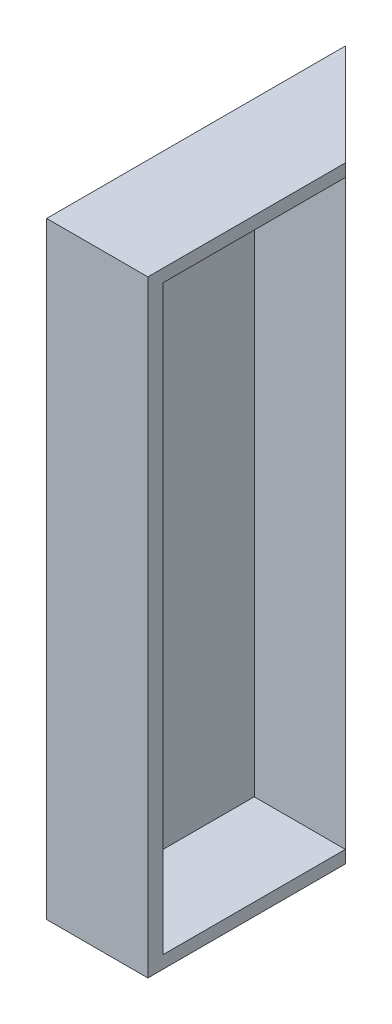
ISO-10303-21;
HEADER;
FILE_DESCRIPTION(('STEP AP214'),'2;1');
FILE_NAME('part.step','',(''),(''),'','','');
FILE_SCHEMA(('AUTOMOTIVE_DESIGN { 1 0 10303 214 1 1 1 1 }'));
ENDSEC;
DATA;
#1=APPLICATION_CONTEXT('core data for automotive mechanical design processes');
#2=APPLICATION_PROTOCOL_DEFINITION('international standard','automotive_design',2000,#1);
#3=PRODUCT_CONTEXT('',#1,'mechanical');
#4=PRODUCT('Part','Part','',(#3));
#5=PRODUCT_RELATED_PRODUCT_CATEGORY('part','',(#4));
#6=PRODUCT_DEFINITION_FORMATION('','',#4);
#7=PRODUCT_DEFINITION_CONTEXT('part definition',#1,'design');
#8=PRODUCT_DEFINITION('design','',#6,#7);
#9=PRODUCT_DEFINITION_SHAPE('','',#8);
#10=(LENGTH_UNIT() NAMED_UNIT(*) SI_UNIT(.MILLI.,.METRE.));
#11=(NAMED_UNIT(*) PLANE_ANGLE_UNIT() SI_UNIT($,.RADIAN.));
#12=(NAMED_UNIT(*) SI_UNIT($,.STERADIAN.) SOLID_ANGLE_UNIT());
#13=UNCERTAINTY_MEASURE_WITH_UNIT(LENGTH_MEASURE(1.E-05),#10,'distance_accuracy_value','');
#14=(GEOMETRIC_REPRESENTATION_CONTEXT(3) GLOBAL_UNCERTAINTY_ASSIGNED_CONTEXT((#13)) GLOBAL_UNIT_ASSIGNED_CONTEXT((#10,
#11,#12)) REPRESENTATION_CONTEXT('',''));
#15=CARTESIAN_POINT('',(0.,0.,0.));
#16=DIRECTION('',(0.,0.,1.));
#17=DIRECTION('',(1.,0.,0.));
#18=AXIS2_PLACEMENT_3D('',#15,#16,#17);
#19=CARTESIAN_POINT('',(0.,60.,22.));
#20=DIRECTION('',(0.,0.,1.));
#21=DIRECTION('',(1.,0.,0.));
#22=AXIS2_PLACEMENT_3D('',#19,#20,#21);
#23=PLANE('',#22);
#24=DIRECTION('',(1.,0.,0.));
#25=VECTOR('',#24,1.);
#26=CARTESIAN_POINT('',(-40.4007940470914,58.75,22.));
#27=LINE('',#26,#25);
#28=CARTESIAN_POINT('',(-21.,58.75,22.));
#29=VERTEX_POINT('',#28);
#30=CARTESIAN_POINT('',(-11.9999999999998,58.75,22.));
#31=VERTEX_POINT('',#30);
#32=EDGE_CURVE('E134',#29,#31,#27,.T.);
#33=ORIENTED_EDGE('',*,*,#32,.F.);
#34=DIRECTION('',(0.,-1.,0.));
#35=VECTOR('',#34,1.);
#36=CARTESIAN_POINT('',(-21.,58.75,22.));
#37=LINE('',#36,#35);
#38=CARTESIAN_POINT('',(-21.,1.25,22.));
#39=VERTEX_POINT('',#38);
#40=EDGE_CURVE('E119',#29,#39,#37,.T.);
#41=ORIENTED_EDGE('',*,*,#40,.T.);
#42=DIRECTION('',(1.,0.,0.));
#43=VECTOR('',#42,1.);
#44=CARTESIAN_POINT('',(-40.4007940470914,1.25,22.));
#45=LINE('',#44,#43);
#46=CARTESIAN_POINT('',(-11.9999999999998,1.25,22.));
#47=VERTEX_POINT('',#46);
#48=EDGE_CURVE('E132',#39,#47,#45,.T.);
#49=ORIENTED_EDGE('',*,*,#48,.T.);
#50=DIRECTION('',(0.,-1.,0.));
#51=VECTOR('',#50,1.);
#52=CARTESIAN_POINT('',(-11.9999999999998,5.,22.));
#53=LINE('',#52,#51);
#54=EDGE_CURVE('E180',#31,#47,#53,.T.);
#55=ORIENTED_EDGE('',*,*,#54,.F.);
#56=EDGE_LOOP('',(#33,#41,#49,#55));
#57=FACE_BOUND('',#56,.T.);
#58=ADVANCED_FACE('F35',(#57),#23,.T.);
#59=CARTESIAN_POINT('',(-40.4007940470914,1.25,0.));
#60=DIRECTION('',(0.,-1.,0.));
#61=DIRECTION('',(0.,0.,-1.));
#62=AXIS2_PLACEMENT_3D('',#59,#60,#61);
#63=PLANE('',#62);
#64=DIRECTION('',(0.,0.,1.));
#65=VECTOR('',#64,1.);
#66=CARTESIAN_POINT('',(-21.,1.25,22.));
#67=LINE('',#66,#65);
#68=CARTESIAN_POINT('',(-21.,1.25,40.0106436452662));
#69=VERTEX_POINT('',#68);
#70=EDGE_CURVE('E115',#39,#69,#67,.T.);
#71=ORIENTED_EDGE('',*,*,#70,.T.);
#72=DIRECTION('',(1.,0.,0.));
#73=VECTOR('',#72,1.);
#74=CARTESIAN_POINT('',(-40.4007940470914,1.25,40.0106436452662));
#75=LINE('',#74,#73);
#76=CARTESIAN_POINT('',(-11.9999999999998,1.25,40.0106436452662));
#77=VERTEX_POINT('',#76);
#78=EDGE_CURVE('E149',#69,#77,#75,.T.);
#79=ORIENTED_EDGE('',*,*,#78,.T.);
#80=DIRECTION('',(0.,0.,-1.));
#81=VECTOR('',#80,1.);
#82=CARTESIAN_POINT('',(-11.9999999999998,1.25,0.));
#83=LINE('',#82,#81);
#84=EDGE_CURVE('E139',#77,#47,#83,.T.);
#85=ORIENTED_EDGE('',*,*,#84,.T.);
#86=ORIENTED_EDGE('',*,*,#48,.F.);
#87=EDGE_LOOP('',(#71,#79,#85,#86));
#88=FACE_BOUND('',#87,.T.);
#89=ADVANCED_FACE('F137',(#88),#63,.F.);
#90=CARTESIAN_POINT('',(-40.4007940470914,0.,40.0106436452662));
#91=DIRECTION('',(0.,0.,1.));
#92=DIRECTION('',(1.,0.,0.));
#93=AXIS2_PLACEMENT_3D('',#90,#91,#92);
#94=PLANE('',#93);
#95=DIRECTION('',(0.,1.,0.));
#96=VECTOR('',#95,1.);
#97=CARTESIAN_POINT('',(-21.,58.75,40.0106436452662));
#98=LINE('',#97,#96);
#99=CARTESIAN_POINT('',(-21.,2.5,40.0106436452662));
#100=VERTEX_POINT('',#99);
#101=EDGE_CURVE('E123',#69,#100,#98,.T.);
#102=ORIENTED_EDGE('',*,*,#101,.T.);
#103=DIRECTION('',(1.,0.,0.));
#104=VECTOR('',#103,1.);
#105=CARTESIAN_POINT('',(-40.4007940470914,2.5,40.0106436452662));
#106=LINE('',#105,#104);
#107=CARTESIAN_POINT('',(-11.9999999999998,2.5,40.0106436452662));
#108=VERTEX_POINT('',#107);
#109=EDGE_CURVE('E141',#100,#108,#106,.T.);
#110=ORIENTED_EDGE('',*,*,#109,.T.);
#111=DIRECTION('',(0.,-1.,0.));
#112=VECTOR('',#111,1.);
#113=CARTESIAN_POINT('',(-11.9999999999998,0.,40.0106436452662));
#114=LINE('',#113,#112);
#115=EDGE_CURVE('E145',#108,#77,#114,.T.);
#116=ORIENTED_EDGE('',*,*,#115,.T.);
#117=ORIENTED_EDGE('',*,*,#78,.F.);
#118=EDGE_LOOP('',(#102,#110,#116,#117));
#119=FACE_BOUND('',#118,.T.);
#120=ADVANCED_FACE('F246',(#119),#94,.F.);
#121=CARTESIAN_POINT('',(-11.9999999999998,5.,22.));
#122=DIRECTION('',(1.,0.,0.));
#123=DIRECTION('',(0.,0.,-1.));
#124=AXIS2_PLACEMENT_3D('',#121,#122,#123);
#125=PLANE('',#124);
#126=DIRECTION('',(0.,-1.,0.));
#127=VECTOR('',#126,1.);
#128=CARTESIAN_POINT('',(-11.9999999999998,70.1115310944917,40.0146252129616));
#129=LINE('',#128,#127);
#130=CARTESIAN_POINT('',(-11.9999999999998,58.75,40.0146252129616));
#131=VERTEX_POINT('',#130);
#132=CARTESIAN_POINT('',(-11.9999999999998,5.,40.0146252129616));
#133=VERTEX_POINT('',#132);
#134=EDGE_CURVE('E167',#131,#133,#129,.T.);
#135=ORIENTED_EDGE('',*,*,#134,.F.);
#136=DIRECTION('',(0.,0.,-1.));
#137=VECTOR('',#136,1.);
#138=CARTESIAN_POINT('',(-11.9999999999998,58.75,0.));
#139=LINE('',#138,#137);
#140=EDGE_CURVE('E212',#131,#31,#139,.T.);
#141=ORIENTED_EDGE('',*,*,#140,.T.);
#142=DIRECTION('',(0.,-1.,0.));
#143=VECTOR('',#142,1.);
#144=CARTESIAN_POINT('',(-11.9999999999998,60.,22.));
#145=LINE('',#144,#143);
#146=CARTESIAN_POINT('',(-11.9999999999998,60.,22.));
#147=VERTEX_POINT('',#146);
#148=EDGE_CURVE('E11',#147,#31,#145,.T.);
#149=ORIENTED_EDGE('',*,*,#148,.F.);
#150=DIRECTION('',(0.,0.,-1.));
#151=VECTOR('',#150,1.);
#152=CARTESIAN_POINT('',(-11.9999999999998,60.,41.5123104518784));
#153=LINE('',#152,#151);
#154=CARTESIAN_POINT('',(-11.9999999999998,60.,41.5123104518784));
#155=VERTEX_POINT('',#154);
#156=EDGE_CURVE('E156',#155,#147,#153,.T.);
#157=ORIENTED_EDGE('',*,*,#156,.F.);
#158=DIRECTION('',(0.,-1.,0.));
#159=VECTOR('',#158,1.);
#160=CARTESIAN_POINT('',(-11.9999999999998,70.1115310944917,41.5123104518784));
#161=LINE('',#160,#159);
#162=CARTESIAN_POINT('',(-11.9999999999998,0.,41.5123104518784));
#163=VERTEX_POINT('',#162);
#164=EDGE_CURVE('E157',#155,#163,#161,.T.);
#165=ORIENTED_EDGE('',*,*,#164,.T.);
#166=DIRECTION('',(0.,0.,1.));
#167=VECTOR('',#166,1.);
#168=CARTESIAN_POINT('',(-11.9999999999998,0.,22.));
#169=LINE('',#168,#167);
#170=CARTESIAN_POINT('',(-11.9999999999998,0.,22.));
#171=VERTEX_POINT('',#170);
#172=EDGE_CURVE('E164',#171,#163,#169,.T.);
#173=ORIENTED_EDGE('',*,*,#172,.F.);
#174=EDGE_CURVE('E178',#47,#171,#53,.T.);
#175=ORIENTED_EDGE('',*,*,#174,.F.);
#176=ORIENTED_EDGE('',*,*,#84,.F.);
#177=ORIENTED_EDGE('',*,*,#115,.F.);
#178=DIRECTION('',(0.,0.999998731771908,0.0015926250583447));
#179=VECTOR('',#178,1.);
#180=CARTESIAN_POINT('',(-11.9999999999998,-0.0637155317195382,40.0065606024897));
#181=LINE('',#180,#179);
#182=EDGE_CURVE('E152',#108,#133,#181,.T.);
#183=ORIENTED_EDGE('',*,*,#182,.T.);
#184=EDGE_LOOP('',(#135,#141,#149,#157,#165,#173,#175,#176,#177,#183));
#185=FACE_BOUND('',#184,.T.);
#186=ADVANCED_FACE('F210',(#185),#125,.T.);
#187=CARTESIAN_POINT('',(-16.9999999999998,60.,17.0000000000001));
#188=DIRECTION('',(0.707106781186541,0.,-0.707106781186553));
#189=DIRECTION('',(-0.707106781186554,0.,-0.707106781186542));
#190=AXIS2_PLACEMENT_3D('',#187,#188,#189);
#191=PLANE('',#190);
#192=DIRECTION('',(0.707106781186554,0.,0.707106781186542));
#193=VECTOR('',#192,1.);
#194=CARTESIAN_POINT('',(-16.9999999999998,0.,17.0000000000001));
#195=LINE('',#194,#193);
#196=CARTESIAN_POINT('',(-22.,0.,12.));
#197=VERTEX_POINT('',#196);
#198=EDGE_CURVE('E183',#197,#171,#195,.T.);
#199=ORIENTED_EDGE('',*,*,#198,.F.);
#200=DIRECTION('',(0.,-1.,0.));
#201=VECTOR('',#200,1.);
#202=CARTESIAN_POINT('',(-22.,60.,12.));
#203=LINE('',#202,#201);
#204=CARTESIAN_POINT('',(-22.,60.,12.));
#205=VERTEX_POINT('',#204);
#206=EDGE_CURVE('E43',#205,#197,#203,.T.);
#207=ORIENTED_EDGE('',*,*,#206,.F.);
#208=DIRECTION('',(0.707106781186554,0.,0.707106781186542));
#209=VECTOR('',#208,1.);
#210=CARTESIAN_POINT('',(-16.9999999999998,60.,17.0000000000001));
#211=LINE('',#210,#209);
#212=EDGE_CURVE('E184',#205,#147,#211,.T.);
#213=ORIENTED_EDGE('',*,*,#212,.T.);
#214=ORIENTED_EDGE('',*,*,#148,.T.);
#215=ORIENTED_EDGE('',*,*,#54,.T.);
#216=ORIENTED_EDGE('',*,*,#174,.T.);
#217=EDGE_LOOP('',(#199,#207,#213,#214,#215,#216));
#218=FACE_BOUND('',#217,.T.);
#219=ADVANCED_FACE('F196',(#218),#191,.T.);
#220=CARTESIAN_POINT('',(-22.,60.,0.));
#221=DIRECTION('',(-1.,0.,0.));
#222=DIRECTION('',(0.,0.,1.));
#223=AXIS2_PLACEMENT_3D('',#220,#221,#222);
#224=PLANE('',#223);
#225=DIRECTION('',(0.,1.,0.));
#226=VECTOR('',#225,1.);
#227=CARTESIAN_POINT('',(-22.,58.75,40.0106436452662));
#228=LINE('',#227,#226);
#229=CARTESIAN_POINT('',(-22.,2.5,40.0106436452662));
#230=VERTEX_POINT('',#229);
#231=CARTESIAN_POINT('',(-22.,58.75,40.0106436452662));
#232=VERTEX_POINT('',#231);
#233=EDGE_CURVE('E135',#230,#232,#228,.T.);
#234=ORIENTED_EDGE('',*,*,#233,.T.);
#235=DIRECTION('',(0.,0.,-1.));
#236=VECTOR('',#235,1.);
#237=CARTESIAN_POINT('',(-22.,58.75,0.));
#238=LINE('',#237,#236);
#239=CARTESIAN_POINT('',(-22.,58.75,40.0146252129616));
#240=VERTEX_POINT('',#239);
#241=EDGE_CURVE('E174',#240,#232,#238,.T.);
#242=ORIENTED_EDGE('',*,*,#241,.F.);
#243=DIRECTION('',(0.,-1.,0.));
#244=VECTOR('',#243,1.);
#245=CARTESIAN_POINT('',(-22.,70.1115310944917,40.0146252129616));
#246=LINE('',#245,#244);
#247=CARTESIAN_POINT('',(-22.,5.,40.0146252129616));
#248=VERTEX_POINT('',#247);
#249=EDGE_CURVE('E162',#240,#248,#246,.T.);
#250=ORIENTED_EDGE('',*,*,#249,.T.);
#251=DIRECTION('',(0.,0.999998731771908,0.0015926250583447));
#252=VECTOR('',#251,1.);
#253=CARTESIAN_POINT('',(-22.,-0.0637155317195382,40.0065606024897));
#254=LINE('',#253,#252);
#255=EDGE_CURVE('E228',#230,#248,#254,.T.);
#256=ORIENTED_EDGE('',*,*,#255,.F.);
#257=EDGE_LOOP('',(#234,#242,#250,#256));
#258=FACE_BOUND('',#257,.T.);
#259=DIRECTION('',(0.,0.,-1.));
#260=VECTOR('',#259,1.);
#261=CARTESIAN_POINT('',(-22.,0.,0.));
#262=LINE('',#261,#260);
#263=CARTESIAN_POINT('',(-22.,0.,41.5123104518784));
#264=VERTEX_POINT('',#263);
#265=EDGE_CURVE('E187',#264,#197,#262,.T.);
#266=ORIENTED_EDGE('',*,*,#265,.F.);
#267=DIRECTION('',(0.,-1.,0.));
#268=VECTOR('',#267,1.);
#269=CARTESIAN_POINT('',(-22.,70.1115310944917,41.5123104518784));
#270=LINE('',#269,#268);
#271=CARTESIAN_POINT('',(-22.,60.,41.5123104518784));
#272=VERTEX_POINT('',#271);
#273=EDGE_CURVE('E161',#272,#264,#270,.T.);
#274=ORIENTED_EDGE('',*,*,#273,.F.);
#275=DIRECTION('',(0.,0.,-1.));
#276=VECTOR('',#275,1.);
#277=CARTESIAN_POINT('',(-22.,60.,0.));
#278=LINE('',#277,#276);
#279=EDGE_CURVE('E186',#272,#205,#278,.T.);
#280=ORIENTED_EDGE('',*,*,#279,.T.);
#281=ORIENTED_EDGE('',*,*,#206,.T.);
#282=EDGE_LOOP('',(#266,#274,#280,#281));
#283=FACE_BOUND('',#282,.T.);
#284=ADVANCED_FACE('F194',(#258,#283),#224,.T.);
#285=CARTESIAN_POINT('',(0.,60.,0.));
#286=DIRECTION('',(0.,1.,0.));
#287=DIRECTION('',(0.,0.,1.));
#288=AXIS2_PLACEMENT_3D('',#285,#286,#287);
#289=PLANE('',#288);
#290=ORIENTED_EDGE('',*,*,#279,.F.);
#291=DIRECTION('',(-1.,0.,0.));
#292=VECTOR('',#291,1.);
#293=CARTESIAN_POINT('',(-11.9999999999998,60.,41.5123104518784));
#294=LINE('',#293,#292);
#295=EDGE_CURVE('E158',#155,#272,#294,.T.);
#296=ORIENTED_EDGE('',*,*,#295,.F.);
#297=ORIENTED_EDGE('',*,*,#156,.T.);
#298=ORIENTED_EDGE('',*,*,#212,.F.);
#299=EDGE_LOOP('',(#290,#296,#297,#298));
#300=FACE_BOUND('',#299,.T.);
#301=ADVANCED_FACE('F206',(#300),#289,.T.);
#302=CARTESIAN_POINT('',(0.,0.,0.));
#303=DIRECTION('',(0.,1.,0.));
#304=DIRECTION('',(0.,0.,1.));
#305=AXIS2_PLACEMENT_3D('',#302,#303,#304);
#306=PLANE('',#305);
#307=ORIENTED_EDGE('',*,*,#198,.T.);
#308=ORIENTED_EDGE('',*,*,#172,.T.);
#309=DIRECTION('',(-1.,0.,0.));
#310=VECTOR('',#309,1.);
#311=CARTESIAN_POINT('',(-11.9999999999998,0.,41.5123104518784));
#312=LINE('',#311,#310);
#313=EDGE_CURVE('E153',#163,#264,#312,.T.);
#314=ORIENTED_EDGE('',*,*,#313,.T.);
#315=ORIENTED_EDGE('',*,*,#265,.T.);
#316=EDGE_LOOP('',(#307,#308,#314,#315));
#317=FACE_BOUND('',#316,.T.);
#318=ADVANCED_FACE('F199',(#317),#306,.F.);
#319=CARTESIAN_POINT('',(-11.9999999999998,70.1115310944917,40.0146252129616));
#320=DIRECTION('',(0.,0.,1.));
#321=DIRECTION('',(1.,0.,0.));
#322=AXIS2_PLACEMENT_3D('',#319,#320,#321);
#323=PLANE('',#322);
#324=ORIENTED_EDGE('',*,*,#249,.F.);
#325=DIRECTION('',(1.,0.,0.));
#326=VECTOR('',#325,1.);
#327=CARTESIAN_POINT('',(-40.4007940470914,58.75,40.0146252129616));
#328=LINE('',#327,#326);
#329=EDGE_CURVE('E151',#240,#131,#328,.T.);
#330=ORIENTED_EDGE('',*,*,#329,.T.);
#331=ORIENTED_EDGE('',*,*,#134,.T.);
#332=DIRECTION('',(-1.,0.,0.));
#333=VECTOR('',#332,1.);
#334=CARTESIAN_POINT('',(-22.,5.,40.0146252129616));
#335=LINE('',#334,#333);
#336=EDGE_CURVE('E175',#133,#248,#335,.T.);
#337=ORIENTED_EDGE('',*,*,#336,.T.);
#338=EDGE_LOOP('',(#324,#330,#331,#337));
#339=FACE_BOUND('',#338,.T.);
#340=ADVANCED_FACE('F248',(#339),#323,.F.);
#341=CARTESIAN_POINT('',(-11.9999999999998,70.1115310944917,41.5123104518784));
#342=DIRECTION('',(0.,0.,1.));
#343=DIRECTION('',(1.,0.,0.));
#344=AXIS2_PLACEMENT_3D('',#341,#342,#343);
#345=PLANE('',#344);
#346=ORIENTED_EDGE('',*,*,#164,.F.);
#347=ORIENTED_EDGE('',*,*,#295,.T.);
#348=ORIENTED_EDGE('',*,*,#273,.T.);
#349=ORIENTED_EDGE('',*,*,#313,.F.);
#350=EDGE_LOOP('',(#346,#347,#348,#349));
#351=FACE_BOUND('',#350,.T.);
#352=ADVANCED_FACE('F202',(#351),#345,.T.);
#353=CARTESIAN_POINT('',(-40.4007940470914,58.75,0.));
#354=DIRECTION('',(0.,-1.,0.));
#355=DIRECTION('',(0.,0.,-1.));
#356=AXIS2_PLACEMENT_3D('',#353,#354,#355);
#357=PLANE('',#356);
#358=DIRECTION('',(-1.,0.,0.));
#359=VECTOR('',#358,1.);
#360=CARTESIAN_POINT('',(-21.,58.75,40.0106436452662));
#361=LINE('',#360,#359);
#362=CARTESIAN_POINT('',(-21.,58.75,40.0106436452662));
#363=VERTEX_POINT('',#362);
#364=EDGE_CURVE('E222',#363,#232,#361,.T.);
#365=ORIENTED_EDGE('',*,*,#364,.F.);
#366=DIRECTION('',(0.,0.,-1.));
#367=VECTOR('',#366,1.);
#368=CARTESIAN_POINT('',(-21.,58.75,22.));
#369=LINE('',#368,#367);
#370=EDGE_CURVE('E233',#363,#29,#369,.T.);
#371=ORIENTED_EDGE('',*,*,#370,.T.);
#372=ORIENTED_EDGE('',*,*,#32,.T.);
#373=ORIENTED_EDGE('',*,*,#140,.F.);
#374=ORIENTED_EDGE('',*,*,#329,.F.);
#375=ORIENTED_EDGE('',*,*,#241,.T.);
#376=EDGE_LOOP('',(#365,#371,#372,#373,#374,#375));
#377=FACE_BOUND('',#376,.T.);
#378=ADVANCED_FACE('F249',(#377),#357,.T.);
#379=CARTESIAN_POINT('',(-40.4007940470914,-0.0637155317195382,40.0065606024897));
#380=DIRECTION('',(0.,0.0015926250583447,-0.999998731771908));
#381=DIRECTION('',(0.,0.999998731771908,0.0015926250583447));
#382=AXIS2_PLACEMENT_3D('',#379,#380,#381);
#383=PLANE('',#382);
#384=ORIENTED_EDGE('',*,*,#255,.T.);
#385=ORIENTED_EDGE('',*,*,#336,.F.);
#386=ORIENTED_EDGE('',*,*,#182,.F.);
#387=ORIENTED_EDGE('',*,*,#109,.F.);
#388=EDGE_CURVE('E143',#230,#100,#106,.T.);
#389=ORIENTED_EDGE('',*,*,#388,.F.);
#390=EDGE_LOOP('',(#384,#385,#386,#387,#389));
#391=FACE_BOUND('',#390,.T.);
#392=ADVANCED_FACE('F242',(#391),#383,.T.);
#393=CARTESIAN_POINT('',(-21.,58.75,40.0106436452662));
#394=DIRECTION('',(0.,0.,1.));
#395=DIRECTION('',(1.,0.,0.));
#396=AXIS2_PLACEMENT_3D('',#393,#394,#395);
#397=PLANE('',#396);
#398=ORIENTED_EDGE('',*,*,#233,.F.);
#399=ORIENTED_EDGE('',*,*,#388,.T.);
#400=EDGE_CURVE('E127',#100,#363,#98,.T.);
#401=ORIENTED_EDGE('',*,*,#400,.T.);
#402=ORIENTED_EDGE('',*,*,#364,.T.);
#403=EDGE_LOOP('',(#398,#399,#401,#402));
#404=FACE_BOUND('',#403,.T.);
#405=ADVANCED_FACE('F240',(#404),#397,.T.);
#406=CARTESIAN_POINT('',(-21.,0.,0.));
#407=DIRECTION('',(-1.,0.,0.));
#408=DIRECTION('',(0.,0.,1.));
#409=AXIS2_PLACEMENT_3D('',#406,#407,#408);
#410=PLANE('',#409);
#411=ORIENTED_EDGE('',*,*,#40,.F.);
#412=ORIENTED_EDGE('',*,*,#370,.F.);
#413=ORIENTED_EDGE('',*,*,#400,.F.);
#414=ORIENTED_EDGE('',*,*,#101,.F.);
#415=ORIENTED_EDGE('',*,*,#70,.F.);
#416=EDGE_LOOP('',(#411,#412,#413,#414,#415));
#417=FACE_BOUND('',#416,.T.);
#418=ADVANCED_FACE('F117',(#417),#410,.F.);
#419=CLOSED_SHELL('',(#58,#89,#120,#186,#219,#284,#301,#318,#340,#352,#378,#392,#405,#418));
#420=MANIFOLD_SOLID_BREP('B2',#419);
#421=ADVANCED_BREP_SHAPE_REPRESENTATION('',(#18,#420),#14);
#422=SHAPE_DEFINITION_REPRESENTATION(#9,#421);
ENDSEC;
END-ISO-10303-21;
